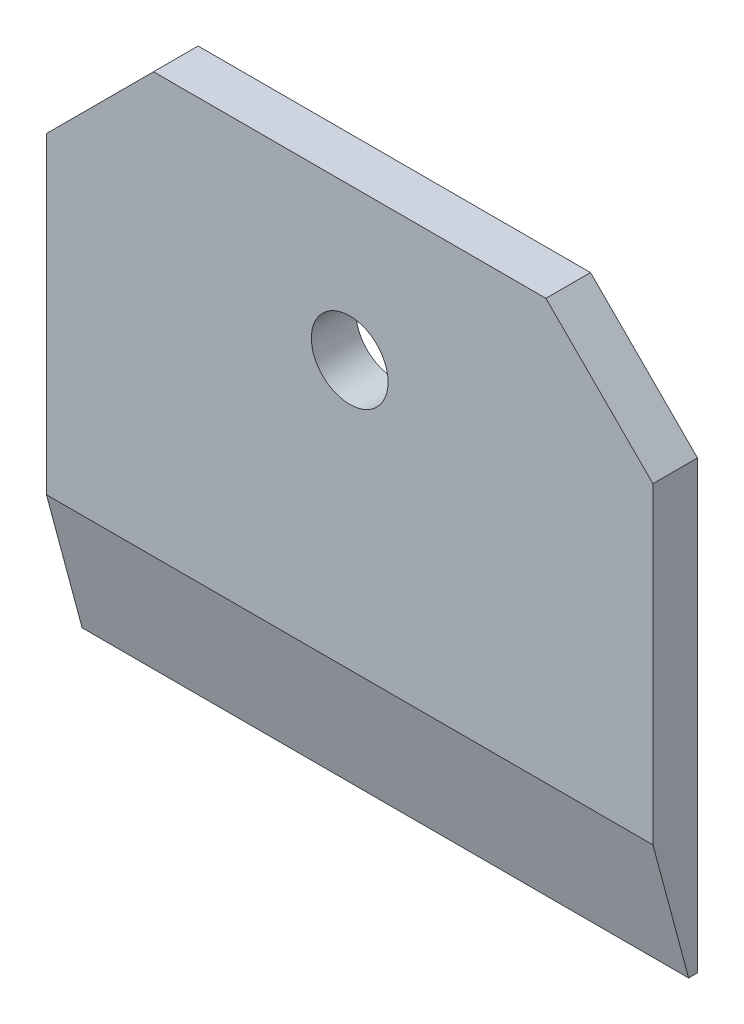
ISO-10303-21;
HEADER;
FILE_DESCRIPTION(('STEP AP214'),'2;1');
FILE_NAME('part.step','',(''),(''),'','','');
FILE_SCHEMA(('AUTOMOTIVE_DESIGN { 1 0 10303 214 1 1 1 1 }'));
ENDSEC;
DATA;
#1=APPLICATION_CONTEXT('core data for automotive mechanical design processes');
#2=APPLICATION_PROTOCOL_DEFINITION('international standard','automotive_design',2000,#1);
#3=PRODUCT_CONTEXT('',#1,'mechanical');
#4=PRODUCT('Part','Part','',(#3));
#5=PRODUCT_RELATED_PRODUCT_CATEGORY('part','',(#4));
#6=PRODUCT_DEFINITION_FORMATION('','',#4);
#7=PRODUCT_DEFINITION_CONTEXT('part definition',#1,'design');
#8=PRODUCT_DEFINITION('design','',#6,#7);
#9=PRODUCT_DEFINITION_SHAPE('','',#8);
#10=(LENGTH_UNIT() NAMED_UNIT(*) SI_UNIT(.MILLI.,.METRE.));
#11=(NAMED_UNIT(*) PLANE_ANGLE_UNIT() SI_UNIT($,.RADIAN.));
#12=(NAMED_UNIT(*) SI_UNIT($,.STERADIAN.) SOLID_ANGLE_UNIT());
#13=UNCERTAINTY_MEASURE_WITH_UNIT(LENGTH_MEASURE(1.E-05),#10,'distance_accuracy_value','');
#14=(GEOMETRIC_REPRESENTATION_CONTEXT(3) GLOBAL_UNCERTAINTY_ASSIGNED_CONTEXT((#13)) GLOBAL_UNIT_ASSIGNED_CONTEXT((#10,
#11,#12)) REPRESENTATION_CONTEXT('',''));
#15=CARTESIAN_POINT('',(0.,0.,0.));
#16=DIRECTION('',(0.,0.,1.));
#17=DIRECTION('',(1.,0.,0.));
#18=AXIS2_PLACEMENT_3D('',#15,#16,#17);
#19=CARTESIAN_POINT('',(-34.,0.,5.));
#20=DIRECTION('',(1.,0.,0.));
#21=DIRECTION('',(0.,0.,-1.));
#22=AXIS2_PLACEMENT_3D('',#19,#20,#21);
#23=PLANE('',#22);
#24=DIRECTION('',(0.,0.,-1.));
#25=VECTOR('',#24,1.);
#26=CARTESIAN_POINT('',(-34.,0.,5.));
#27=LINE('',#26,#25);
#28=CARTESIAN_POINT('',(-34.,0.,0.999999999999993));
#29=VERTEX_POINT('',#28);
#30=CARTESIAN_POINT('',(-34.,0.,0.));
#31=VERTEX_POINT('',#30);
#32=EDGE_CURVE('E144',#29,#31,#27,.T.);
#33=ORIENTED_EDGE('',*,*,#32,.F.);
#34=DIRECTION('',(0.,-0.965925826289068,-0.258819045102522));
#35=VECTOR('',#34,1.);
#36=CARTESIAN_POINT('',(-34.,14.9282032302755,5.));
#37=LINE('',#36,#35);
#38=CARTESIAN_POINT('',(-34.,14.9282032302755,5.));
#39=VERTEX_POINT('',#38);
#40=EDGE_CURVE('E11',#29,#39,#37,.F.);
#41=ORIENTED_EDGE('',*,*,#40,.T.);
#42=DIRECTION('',(0.,-1.,0.));
#43=VECTOR('',#42,1.);
#44=CARTESIAN_POINT('',(-34.,0.,5.));
#45=LINE('',#44,#43);
#46=CARTESIAN_POINT('',(-34.,50.,5.));
#47=VERTEX_POINT('',#46);
#48=EDGE_CURVE('E100',#47,#39,#45,.T.);
#49=ORIENTED_EDGE('',*,*,#48,.F.);
#50=DIRECTION('',(0.,0.,-1.));
#51=VECTOR('',#50,1.);
#52=CARTESIAN_POINT('',(-34.,50.,5.));
#53=LINE('',#52,#51);
#54=CARTESIAN_POINT('',(-34.,50.,0.));
#55=VERTEX_POINT('',#54);
#56=EDGE_CURVE('E122',#47,#55,#53,.T.);
#57=ORIENTED_EDGE('',*,*,#56,.T.);
#58=DIRECTION('',(0.,-1.,0.));
#59=VECTOR('',#58,1.);
#60=CARTESIAN_POINT('',(-34.,0.,0.));
#61=LINE('',#60,#59);
#62=EDGE_CURVE('E123',#55,#31,#61,.T.);
#63=ORIENTED_EDGE('',*,*,#62,.T.);
#64=EDGE_LOOP('',(#33,#41,#49,#57,#63));
#65=FACE_BOUND('',#64,.T.);
#66=ADVANCED_FACE('F35',(#65),#23,.F.);
#67=CARTESIAN_POINT('',(-34.,0.,5.));
#68=DIRECTION('',(0.,1.,0.));
#69=DIRECTION('',(-1.,0.,0.));
#70=AXIS2_PLACEMENT_3D('',#67,#68,#69);
#71=PLANE('',#70);
#72=DIRECTION('',(0.,0.,-1.));
#73=VECTOR('',#72,1.);
#74=CARTESIAN_POINT('',(34.,0.,5.));
#75=LINE('',#74,#73);
#76=CARTESIAN_POINT('',(34.,0.,0.999999999999993));
#77=VERTEX_POINT('',#76);
#78=CARTESIAN_POINT('',(34.,0.,0.));
#79=VERTEX_POINT('',#78);
#80=EDGE_CURVE('E109',#77,#79,#75,.T.);
#81=ORIENTED_EDGE('',*,*,#80,.F.);
#82=DIRECTION('',(-1.,0.,0.));
#83=VECTOR('',#82,1.);
#84=CARTESIAN_POINT('',(-34.,0.,0.999999999999993));
#85=LINE('',#84,#83);
#86=EDGE_CURVE('E43',#77,#29,#85,.T.);
#87=ORIENTED_EDGE('',*,*,#86,.T.);
#88=ORIENTED_EDGE('',*,*,#32,.T.);
#89=DIRECTION('',(1.,0.,0.));
#90=VECTOR('',#89,1.);
#91=CARTESIAN_POINT('',(-34.,0.,0.));
#92=LINE('',#91,#90);
#93=EDGE_CURVE('E126',#31,#79,#92,.T.);
#94=ORIENTED_EDGE('',*,*,#93,.T.);
#95=EDGE_LOOP('',(#81,#87,#88,#94));
#96=FACE_BOUND('',#95,.T.);
#97=ADVANCED_FACE('F148',(#96),#71,.F.);
#98=CARTESIAN_POINT('',(34.,0.,5.));
#99=DIRECTION('',(-1.,0.,0.));
#100=DIRECTION('',(0.,0.,1.));
#101=AXIS2_PLACEMENT_3D('',#98,#99,#100);
#102=PLANE('',#101);
#103=DIRECTION('',(0.,1.,0.));
#104=VECTOR('',#103,1.);
#105=CARTESIAN_POINT('',(34.,0.,5.));
#106=LINE('',#105,#104);
#107=CARTESIAN_POINT('',(34.,14.9282032302755,5.));
#108=VERTEX_POINT('',#107);
#109=CARTESIAN_POINT('',(34.,50.,5.));
#110=VERTEX_POINT('',#109);
#111=EDGE_CURVE('E91',#108,#110,#106,.T.);
#112=ORIENTED_EDGE('',*,*,#111,.F.);
#113=DIRECTION('',(0.,0.965925826289068,0.258819045102522));
#114=VECTOR('',#113,1.);
#115=CARTESIAN_POINT('',(34.,14.9282032302755,5.));
#116=LINE('',#115,#114);
#117=EDGE_CURVE('E57',#108,#77,#116,.F.);
#118=ORIENTED_EDGE('',*,*,#117,.T.);
#119=ORIENTED_EDGE('',*,*,#80,.T.);
#120=DIRECTION('',(0.,1.,0.));
#121=VECTOR('',#120,1.);
#122=CARTESIAN_POINT('',(34.,0.,0.));
#123=LINE('',#122,#121);
#124=CARTESIAN_POINT('',(34.,50.,0.));
#125=VERTEX_POINT('',#124);
#126=EDGE_CURVE('E106',#79,#125,#123,.T.);
#127=ORIENTED_EDGE('',*,*,#126,.T.);
#128=DIRECTION('',(0.,0.,-1.));
#129=VECTOR('',#128,1.);
#130=CARTESIAN_POINT('',(34.,50.,5.));
#131=LINE('',#130,#129);
#132=EDGE_CURVE('E103',#110,#125,#131,.T.);
#133=ORIENTED_EDGE('',*,*,#132,.F.);
#134=EDGE_LOOP('',(#112,#118,#119,#127,#133));
#135=FACE_BOUND('',#134,.T.);
#136=ADVANCED_FACE('F104',(#135),#102,.F.);
#137=CARTESIAN_POINT('',(22.,62.,5.));
#138=DIRECTION('',(-0.707106781186546,-0.707106781186549,0.));
#139=DIRECTION('',(0.707106781186549,-0.707106781186546,0.));
#140=AXIS2_PLACEMENT_3D('',#137,#138,#139);
#141=PLANE('',#140);
#142=DIRECTION('',(-0.707106781186549,0.707106781186546,0.));
#143=VECTOR('',#142,1.);
#144=CARTESIAN_POINT('',(22.,62.,0.));
#145=LINE('',#144,#143);
#146=CARTESIAN_POINT('',(22.,62.,0.));
#147=VERTEX_POINT('',#146);
#148=EDGE_CURVE('E131',#125,#147,#145,.T.);
#149=ORIENTED_EDGE('',*,*,#148,.T.);
#150=DIRECTION('',(0.,0.,-1.));
#151=VECTOR('',#150,1.);
#152=CARTESIAN_POINT('',(22.,62.,5.));
#153=LINE('',#152,#151);
#154=CARTESIAN_POINT('',(22.,62.,5.));
#155=VERTEX_POINT('',#154);
#156=EDGE_CURVE('E110',#155,#147,#153,.T.);
#157=ORIENTED_EDGE('',*,*,#156,.F.);
#158=DIRECTION('',(-0.707106781186549,0.707106781186546,0.));
#159=VECTOR('',#158,1.);
#160=CARTESIAN_POINT('',(22.,62.,5.));
#161=LINE('',#160,#159);
#162=EDGE_CURVE('E96',#110,#155,#161,.T.);
#163=ORIENTED_EDGE('',*,*,#162,.F.);
#164=ORIENTED_EDGE('',*,*,#132,.T.);
#165=EDGE_LOOP('',(#149,#157,#163,#164));
#166=FACE_BOUND('',#165,.T.);
#167=ADVANCED_FACE('F112',(#166),#141,.F.);
#168=CARTESIAN_POINT('',(-22.,62.,5.));
#169=DIRECTION('',(0.,-1.,0.));
#170=DIRECTION('',(0.,0.,-1.));
#171=AXIS2_PLACEMENT_3D('',#168,#169,#170);
#172=PLANE('',#171);
#173=DIRECTION('',(-1.,0.,0.));
#174=VECTOR('',#173,1.);
#175=CARTESIAN_POINT('',(-22.,62.,0.));
#176=LINE('',#175,#174);
#177=CARTESIAN_POINT('',(-22.,62.,0.));
#178=VERTEX_POINT('',#177);
#179=EDGE_CURVE('E133',#147,#178,#176,.T.);
#180=ORIENTED_EDGE('',*,*,#179,.T.);
#181=DIRECTION('',(0.,0.,-1.));
#182=VECTOR('',#181,1.);
#183=CARTESIAN_POINT('',(-22.,62.,5.));
#184=LINE('',#183,#182);
#185=CARTESIAN_POINT('',(-22.,62.,5.));
#186=VERTEX_POINT('',#185);
#187=EDGE_CURVE('E139',#186,#178,#184,.T.);
#188=ORIENTED_EDGE('',*,*,#187,.F.);
#189=DIRECTION('',(-1.,0.,0.));
#190=VECTOR('',#189,1.);
#191=CARTESIAN_POINT('',(-22.,62.,5.));
#192=LINE('',#191,#190);
#193=EDGE_CURVE('E115',#155,#186,#192,.T.);
#194=ORIENTED_EDGE('',*,*,#193,.F.);
#195=ORIENTED_EDGE('',*,*,#156,.T.);
#196=EDGE_LOOP('',(#180,#188,#194,#195));
#197=FACE_BOUND('',#196,.T.);
#198=ADVANCED_FACE('F163',(#197),#172,.F.);
#199=CARTESIAN_POINT('',(-34.,50.,5.));
#200=DIRECTION('',(0.707106781186547,-0.707106781186548,0.));
#201=DIRECTION('',(0.707106781186548,0.707106781186547,0.));
#202=AXIS2_PLACEMENT_3D('',#199,#200,#201);
#203=PLANE('',#202);
#204=DIRECTION('',(-0.707106781186548,-0.707106781186547,0.));
#205=VECTOR('',#204,1.);
#206=CARTESIAN_POINT('',(-34.,50.,0.));
#207=LINE('',#206,#205);
#208=EDGE_CURVE('E135',#178,#55,#207,.T.);
#209=ORIENTED_EDGE('',*,*,#208,.T.);
#210=ORIENTED_EDGE('',*,*,#56,.F.);
#211=DIRECTION('',(-0.707106781186548,-0.707106781186547,0.));
#212=VECTOR('',#211,1.);
#213=CARTESIAN_POINT('',(-34.,50.,5.));
#214=LINE('',#213,#212);
#215=EDGE_CURVE('E117',#186,#47,#214,.T.);
#216=ORIENTED_EDGE('',*,*,#215,.F.);
#217=ORIENTED_EDGE('',*,*,#187,.T.);
#218=EDGE_LOOP('',(#209,#210,#216,#217));
#219=FACE_BOUND('',#218,.T.);
#220=ADVANCED_FACE('F159',(#219),#203,.F.);
#221=CARTESIAN_POINT('',(0.,0.,5.));
#222=DIRECTION('',(0.,0.,-1.));
#223=DIRECTION('',(-1.,0.,0.));
#224=AXIS2_PLACEMENT_3D('',#221,#222,#223);
#225=PLANE('',#224);
#226=CARTESIAN_POINT('',(0.,45.,5.));
#227=DIRECTION('',(0.,0.,1.));
#228=DIRECTION('',(1.,0.,0.));
#229=AXIS2_PLACEMENT_3D('',#226,#227,#228);
#230=CIRCLE('',#229,4.29999999999999);
#231=CARTESIAN_POINT('',(4.29999999999999,45.,5.));
#232=VERTEX_POINT('',#231);
#233=EDGE_CURVE('E195',#232,#232,#230,.T.);
#234=ORIENTED_EDGE('',*,*,#233,.F.);
#235=EDGE_LOOP('',(#234));
#236=FACE_BOUND('',#235,.T.);
#237=ORIENTED_EDGE('',*,*,#48,.T.);
#238=DIRECTION('',(1.,0.,0.));
#239=VECTOR('',#238,1.);
#240=CARTESIAN_POINT('',(0.,14.9282032302755,5.));
#241=LINE('',#240,#239);
#242=EDGE_CURVE('E99',#39,#108,#241,.T.);
#243=ORIENTED_EDGE('',*,*,#242,.T.);
#244=ORIENTED_EDGE('',*,*,#111,.T.);
#245=ORIENTED_EDGE('',*,*,#162,.T.);
#246=ORIENTED_EDGE('',*,*,#193,.T.);
#247=ORIENTED_EDGE('',*,*,#215,.T.);
#248=EDGE_LOOP('',(#237,#243,#244,#245,#246,#247));
#249=FACE_BOUND('',#248,.T.);
#250=ADVANCED_FACE('F94',(#236,#249),#225,.F.);
#251=CARTESIAN_POINT('',(0.,0.,0.));
#252=DIRECTION('',(0.,0.,-1.));
#253=DIRECTION('',(-1.,0.,0.));
#254=AXIS2_PLACEMENT_3D('',#251,#252,#253);
#255=PLANE('',#254);
#256=CARTESIAN_POINT('',(0.,45.,0.));
#257=DIRECTION('',(0.,0.,-1.));
#258=DIRECTION('',(-1.,0.,0.));
#259=AXIS2_PLACEMENT_3D('',#256,#257,#258);
#260=CIRCLE('',#259,4.29999999999998);
#261=CARTESIAN_POINT('',(-4.29999999999998,45.,0.));
#262=VERTEX_POINT('',#261);
#263=EDGE_CURVE('E127',#262,#262,#260,.T.);
#264=ORIENTED_EDGE('',*,*,#263,.F.);
#265=EDGE_LOOP('',(#264));
#266=FACE_BOUND('',#265,.T.);
#267=ORIENTED_EDGE('',*,*,#62,.F.);
#268=ORIENTED_EDGE('',*,*,#208,.F.);
#269=ORIENTED_EDGE('',*,*,#179,.F.);
#270=ORIENTED_EDGE('',*,*,#148,.F.);
#271=ORIENTED_EDGE('',*,*,#126,.F.);
#272=ORIENTED_EDGE('',*,*,#93,.F.);
#273=EDGE_LOOP('',(#267,#268,#269,#270,#271,#272));
#274=FACE_BOUND('',#273,.T.);
#275=ADVANCED_FACE('F153',(#266,#274),#255,.T.);
#276=CARTESIAN_POINT('',(0.,45.,5.));
#277=DIRECTION('',(0.,0.,1.));
#278=DIRECTION('',(1.,0.,0.));
#279=AXIS2_PLACEMENT_3D('',#276,#277,#278);
#280=CYLINDRICAL_SURFACE('',#279,4.29999999999998);
#281=ORIENTED_EDGE('',*,*,#263,.T.);
#282=EDGE_LOOP('',(#281));
#283=FACE_BOUND('',#282,.T.);
#284=ORIENTED_EDGE('',*,*,#233,.T.);
#285=EDGE_LOOP('',(#284));
#286=FACE_BOUND('',#285,.T.);
#287=ADVANCED_FACE('F166',(#283,#286),#280,.F.);
#288=CARTESIAN_POINT('',(0.,14.9282032302755,5.));
#289=DIRECTION('',(0.,0.258819045102522,-0.965925826289068));
#290=DIRECTION('',(1.,0.,0.));
#291=AXIS2_PLACEMENT_3D('',#288,#289,#290);
#292=PLANE('',#291);
#293=ORIENTED_EDGE('',*,*,#40,.F.);
#294=ORIENTED_EDGE('',*,*,#86,.F.);
#295=ORIENTED_EDGE('',*,*,#117,.F.);
#296=ORIENTED_EDGE('',*,*,#242,.F.);
#297=EDGE_LOOP('',(#293,#294,#295,#296));
#298=FACE_BOUND('',#297,.T.);
#299=ADVANCED_FACE('F37',(#298),#292,.F.);
#300=CLOSED_SHELL('',(#66,#97,#136,#167,#198,#220,#250,#275,#287,#299));
#301=MANIFOLD_SOLID_BREP('B2',#300);
#302=ADVANCED_BREP_SHAPE_REPRESENTATION('',(#18,#301),#14);
#303=SHAPE_DEFINITION_REPRESENTATION(#9,#302);
ENDSEC;
END-ISO-10303-21;
